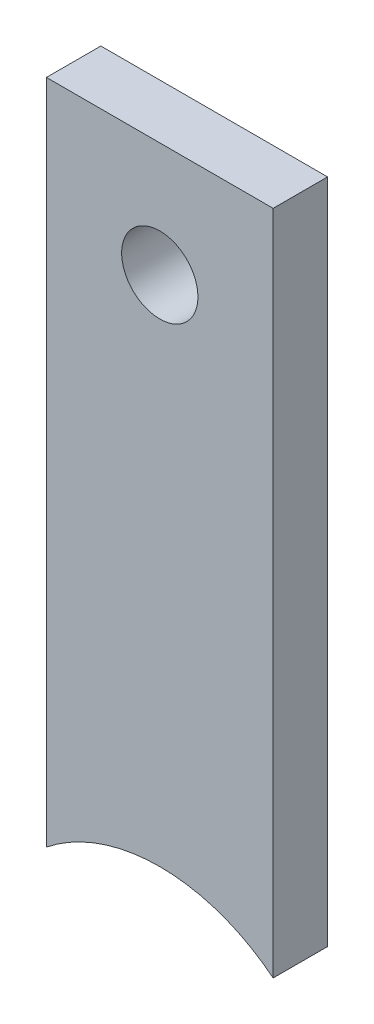
ISO-10303-21;
HEADER;
FILE_DESCRIPTION(('STEP AP214'),'2;1');
FILE_NAME('part.step','',(''),(''),'','','');
FILE_SCHEMA(('AUTOMOTIVE_DESIGN { 1 0 10303 214 1 1 1 1 }'));
ENDSEC;
DATA;
#1=APPLICATION_CONTEXT('core data for automotive mechanical design processes');
#2=APPLICATION_PROTOCOL_DEFINITION('international standard','automotive_design',2000,#1);
#3=PRODUCT_CONTEXT('',#1,'mechanical');
#4=PRODUCT('Part','Part','',(#3));
#5=PRODUCT_RELATED_PRODUCT_CATEGORY('part','',(#4));
#6=PRODUCT_DEFINITION_FORMATION('','',#4);
#7=PRODUCT_DEFINITION_CONTEXT('part definition',#1,'design');
#8=PRODUCT_DEFINITION('design','',#6,#7);
#9=PRODUCT_DEFINITION_SHAPE('','',#8);
#10=(LENGTH_UNIT() NAMED_UNIT(*) SI_UNIT(.MILLI.,.METRE.));
#11=(NAMED_UNIT(*) PLANE_ANGLE_UNIT() SI_UNIT($,.RADIAN.));
#12=(NAMED_UNIT(*) SI_UNIT($,.STERADIAN.) SOLID_ANGLE_UNIT());
#13=UNCERTAINTY_MEASURE_WITH_UNIT(LENGTH_MEASURE(1.E-05),#10,'distance_accuracy_value','');
#14=(GEOMETRIC_REPRESENTATION_CONTEXT(3) GLOBAL_UNCERTAINTY_ASSIGNED_CONTEXT((#13)) GLOBAL_UNIT_ASSIGNED_CONTEXT((#10,
#11,#12)) REPRESENTATION_CONTEXT('',''));
#15=CARTESIAN_POINT('',(0.,0.,0.));
#16=DIRECTION('',(0.,0.,1.));
#17=DIRECTION('',(1.,0.,0.));
#18=AXIS2_PLACEMENT_3D('',#15,#16,#17);
#19=CARTESIAN_POINT('',(0.,-104.724989991992,12.));
#20=DIRECTION('',(0.,0.,1.));
#21=DIRECTION('',(1.,0.,0.));
#22=AXIS2_PLACEMENT_3D('',#19,#20,#21);
#23=PLANE('',#22);
#24=DIRECTION('',(0.,1.,0.));
#25=VECTOR('',#24,1.);
#26=CARTESIAN_POINT('',(25.,-73.5,12.));
#27=LINE('',#26,#25);
#28=CARTESIAN_POINT('',(25.,-73.5,12.));
#29=VERTEX_POINT('',#28);
#30=CARTESIAN_POINT('',(25.,73.5,12.));
#31=VERTEX_POINT('',#30);
#32=EDGE_CURVE('E85',#29,#31,#27,.T.);
#33=ORIENTED_EDGE('',*,*,#32,.T.);
#34=DIRECTION('',(-1.,0.,0.));
#35=VECTOR('',#34,1.);
#36=CARTESIAN_POINT('',(-25.,73.5,12.));
#37=LINE('',#36,#35);
#38=CARTESIAN_POINT('',(-25.,73.5,12.));
#39=VERTEX_POINT('',#38);
#40=EDGE_CURVE('E80',#31,#39,#37,.T.);
#41=ORIENTED_EDGE('',*,*,#40,.T.);
#42=DIRECTION('',(0.,-1.,0.));
#43=VECTOR('',#42,1.);
#44=CARTESIAN_POINT('',(-25.,-73.5,12.));
#45=LINE('',#44,#43);
#46=CARTESIAN_POINT('',(-25.,-73.5,12.));
#47=VERTEX_POINT('',#46);
#48=EDGE_CURVE('E83',#39,#47,#45,.T.);
#49=ORIENTED_EDGE('',*,*,#48,.T.);
#50=CARTESIAN_POINT('',(0.,-104.724989991992,12.));
#51=DIRECTION('',(0.,0.,-1.));
#52=DIRECTION('',(1.,0.,0.));
#53=AXIS2_PLACEMENT_3D('',#50,#51,#52);
#54=CIRCLE('',#53,40.);
#55=EDGE_CURVE('E50',#47,#29,#54,.T.);
#56=ORIENTED_EDGE('',*,*,#55,.T.);
#57=EDGE_LOOP('',(#33,#41,#49,#56));
#58=FACE_BOUND('',#57,.T.);
#59=CARTESIAN_POINT('',(0.,48.275010008008,12.));
#60=DIRECTION('',(0.,0.,1.));
#61=DIRECTION('',(1.,0.,0.));
#62=AXIS2_PLACEMENT_3D('',#59,#60,#61);
#63=CIRCLE('',#62,8.41295297608265);
#64=CARTESIAN_POINT('',(8.41295297608265,48.275010008008,12.));
#65=VERTEX_POINT('',#64);
#66=EDGE_CURVE('E100',#65,#65,#63,.T.);
#67=ORIENTED_EDGE('',*,*,#66,.F.);
#68=EDGE_LOOP('',(#67));
#69=FACE_BOUND('',#68,.T.);
#70=ADVANCED_FACE('F33',(#58,#69),#23,.T.);
#71=CARTESIAN_POINT('',(0.,-104.724989991992,0.));
#72=DIRECTION('',(0.,0.,1.));
#73=DIRECTION('',(1.,0.,0.));
#74=AXIS2_PLACEMENT_3D('',#71,#72,#73);
#75=PLANE('',#74);
#76=DIRECTION('',(0.,1.,0.));
#77=VECTOR('',#76,1.);
#78=CARTESIAN_POINT('',(25.,-73.5,0.));
#79=LINE('',#78,#77);
#80=CARTESIAN_POINT('',(25.,-73.5,0.));
#81=VERTEX_POINT('',#80);
#82=CARTESIAN_POINT('',(25.,73.5,0.));
#83=VERTEX_POINT('',#82);
#84=EDGE_CURVE('E97',#81,#83,#79,.T.);
#85=ORIENTED_EDGE('',*,*,#84,.F.);
#86=CARTESIAN_POINT('',(0.,-104.724989991992,0.));
#87=DIRECTION('',(0.,0.,-1.));
#88=DIRECTION('',(1.,0.,0.));
#89=AXIS2_PLACEMENT_3D('',#86,#87,#88);
#90=CIRCLE('',#89,40.);
#91=CARTESIAN_POINT('',(-25.,-73.5,0.));
#92=VERTEX_POINT('',#91);
#93=EDGE_CURVE('E73',#92,#81,#90,.T.);
#94=ORIENTED_EDGE('',*,*,#93,.F.);
#95=DIRECTION('',(0.,-1.,0.));
#96=VECTOR('',#95,1.);
#97=CARTESIAN_POINT('',(-25.,-73.5,0.));
#98=LINE('',#97,#96);
#99=CARTESIAN_POINT('',(-25.,73.5,0.));
#100=VERTEX_POINT('',#99);
#101=EDGE_CURVE('E67',#100,#92,#98,.T.);
#102=ORIENTED_EDGE('',*,*,#101,.F.);
#103=DIRECTION('',(-1.,0.,0.));
#104=VECTOR('',#103,1.);
#105=CARTESIAN_POINT('',(-25.,73.5,0.));
#106=LINE('',#105,#104);
#107=EDGE_CURVE('E89',#83,#100,#106,.T.);
#108=ORIENTED_EDGE('',*,*,#107,.F.);
#109=EDGE_LOOP('',(#85,#94,#102,#108));
#110=FACE_BOUND('',#109,.T.);
#111=CARTESIAN_POINT('',(0.,48.275010008008,0.));
#112=DIRECTION('',(0.,0.,1.));
#113=DIRECTION('',(1.,0.,0.));
#114=AXIS2_PLACEMENT_3D('',#111,#112,#113);
#115=CIRCLE('',#114,8.41295297608265);
#116=CARTESIAN_POINT('',(8.41295297608265,48.275010008008,0.));
#117=VERTEX_POINT('',#116);
#118=EDGE_CURVE('E112',#117,#117,#115,.T.);
#119=ORIENTED_EDGE('',*,*,#118,.T.);
#120=EDGE_LOOP('',(#119));
#121=FACE_BOUND('',#120,.T.);
#122=ADVANCED_FACE('F108',(#110,#121),#75,.F.);
#123=CARTESIAN_POINT('',(25.,-73.5,12.));
#124=DIRECTION('',(-1.,0.,0.));
#125=DIRECTION('',(0.,0.,1.));
#126=AXIS2_PLACEMENT_3D('',#123,#124,#125);
#127=PLANE('',#126);
#128=ORIENTED_EDGE('',*,*,#84,.T.);
#129=DIRECTION('',(0.,0.,-1.));
#130=VECTOR('',#129,1.);
#131=CARTESIAN_POINT('',(25.,73.5,12.));
#132=LINE('',#131,#130);
#133=EDGE_CURVE('E11',#31,#83,#132,.T.);
#134=ORIENTED_EDGE('',*,*,#133,.F.);
#135=ORIENTED_EDGE('',*,*,#32,.F.);
#136=DIRECTION('',(0.,0.,-1.));
#137=VECTOR('',#136,1.);
#138=CARTESIAN_POINT('',(25.,-73.5,12.));
#139=LINE('',#138,#137);
#140=EDGE_CURVE('E93',#29,#81,#139,.T.);
#141=ORIENTED_EDGE('',*,*,#140,.T.);
#142=EDGE_LOOP('',(#128,#134,#135,#141));
#143=FACE_BOUND('',#142,.T.);
#144=ADVANCED_FACE('F35',(#143),#127,.F.);
#145=CARTESIAN_POINT('',(-25.,73.5,12.));
#146=DIRECTION('',(0.,-1.,0.));
#147=DIRECTION('',(0.,0.,-1.));
#148=AXIS2_PLACEMENT_3D('',#145,#146,#147);
#149=PLANE('',#148);
#150=ORIENTED_EDGE('',*,*,#107,.T.);
#151=DIRECTION('',(0.,0.,-1.));
#152=VECTOR('',#151,1.);
#153=CARTESIAN_POINT('',(-25.,73.5,12.));
#154=LINE('',#153,#152);
#155=EDGE_CURVE('E42',#39,#100,#154,.T.);
#156=ORIENTED_EDGE('',*,*,#155,.F.);
#157=ORIENTED_EDGE('',*,*,#40,.F.);
#158=ORIENTED_EDGE('',*,*,#133,.T.);
#159=EDGE_LOOP('',(#150,#156,#157,#158));
#160=FACE_BOUND('',#159,.T.);
#161=ADVANCED_FACE('F88',(#160),#149,.F.);
#162=CARTESIAN_POINT('',(-25.,-73.5,12.));
#163=DIRECTION('',(1.,0.,0.));
#164=DIRECTION('',(0.,0.,-1.));
#165=AXIS2_PLACEMENT_3D('',#162,#163,#164);
#166=PLANE('',#165);
#167=ORIENTED_EDGE('',*,*,#101,.T.);
#168=DIRECTION('',(0.,0.,-1.));
#169=VECTOR('',#168,1.);
#170=CARTESIAN_POINT('',(-25.,-73.5,12.));
#171=LINE('',#170,#169);
#172=EDGE_CURVE('E90',#47,#92,#171,.T.);
#173=ORIENTED_EDGE('',*,*,#172,.F.);
#174=ORIENTED_EDGE('',*,*,#48,.F.);
#175=ORIENTED_EDGE('',*,*,#155,.T.);
#176=EDGE_LOOP('',(#167,#173,#174,#175));
#177=FACE_BOUND('',#176,.T.);
#178=ADVANCED_FACE('F91',(#177),#166,.F.);
#179=CARTESIAN_POINT('',(0.,-104.724989991992,12.));
#180=DIRECTION('',(0.,0.,-1.));
#181=DIRECTION('',(-1.,0.,0.));
#182=AXIS2_PLACEMENT_3D('',#179,#180,#181);
#183=CYLINDRICAL_SURFACE('',#182,40.);
#184=ORIENTED_EDGE('',*,*,#93,.T.);
#185=ORIENTED_EDGE('',*,*,#140,.F.);
#186=ORIENTED_EDGE('',*,*,#55,.F.);
#187=ORIENTED_EDGE('',*,*,#172,.T.);
#188=EDGE_LOOP('',(#184,#185,#186,#187));
#189=FACE_BOUND('',#188,.T.);
#190=ADVANCED_FACE('F105',(#189),#183,.F.);
#191=CARTESIAN_POINT('',(0.,48.275010008008,12.));
#192=DIRECTION('',(0.,0.,-1.));
#193=DIRECTION('',(-1.,0.,0.));
#194=AXIS2_PLACEMENT_3D('',#191,#192,#193);
#195=CYLINDRICAL_SURFACE('',#194,8.41295297608265);
#196=ORIENTED_EDGE('',*,*,#66,.T.);
#197=EDGE_LOOP('',(#196));
#198=FACE_BOUND('',#197,.T.);
#199=ORIENTED_EDGE('',*,*,#118,.F.);
#200=EDGE_LOOP('',(#199));
#201=FACE_BOUND('',#200,.T.);
#202=ADVANCED_FACE('F118',(#198,#201),#195,.F.);
#203=CLOSED_SHELL('',(#70,#122,#144,#161,#178,#190,#202));
#204=MANIFOLD_SOLID_BREP('B2',#203);
#205=ADVANCED_BREP_SHAPE_REPRESENTATION('',(#18,#204),#14);
#206=SHAPE_DEFINITION_REPRESENTATION(#9,#205);
ENDSEC;
END-ISO-10303-21;
